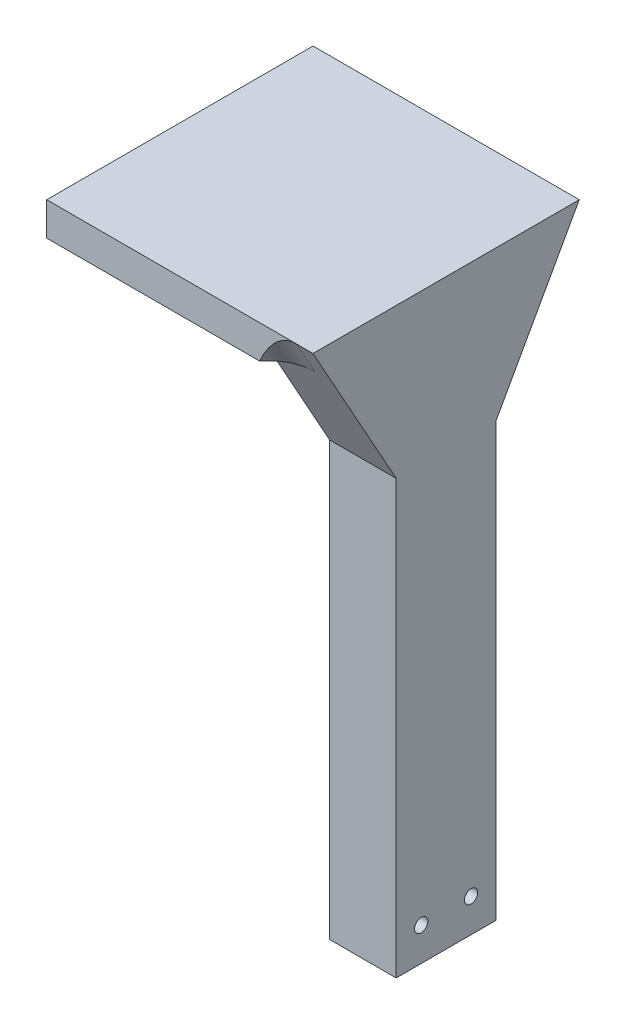
ISO-10303-21;
HEADER;
FILE_DESCRIPTION(('STEP AP214'),'2;1');
FILE_NAME('part.step','',(''),(''),'','','');
FILE_SCHEMA(('AUTOMOTIVE_DESIGN { 1 0 10303 214 1 1 1 1 }'));
ENDSEC;
DATA;
#1=APPLICATION_CONTEXT('core data for automotive mechanical design processes');
#2=APPLICATION_PROTOCOL_DEFINITION('international standard','automotive_design',2000,#1);
#3=PRODUCT_CONTEXT('',#1,'mechanical');
#4=PRODUCT('Part','Part','',(#3));
#5=PRODUCT_RELATED_PRODUCT_CATEGORY('part','',(#4));
#6=PRODUCT_DEFINITION_FORMATION('','',#4);
#7=PRODUCT_DEFINITION_CONTEXT('part definition',#1,'design');
#8=PRODUCT_DEFINITION('design','',#6,#7);
#9=PRODUCT_DEFINITION_SHAPE('','',#8);
#10=(LENGTH_UNIT() NAMED_UNIT(*) SI_UNIT(.MILLI.,.METRE.));
#11=(NAMED_UNIT(*) PLANE_ANGLE_UNIT() SI_UNIT($,.RADIAN.));
#12=(NAMED_UNIT(*) SI_UNIT($,.STERADIAN.) SOLID_ANGLE_UNIT());
#13=UNCERTAINTY_MEASURE_WITH_UNIT(LENGTH_MEASURE(1.E-05),#10,'distance_accuracy_value','');
#14=(GEOMETRIC_REPRESENTATION_CONTEXT(3) GLOBAL_UNCERTAINTY_ASSIGNED_CONTEXT((#13)) GLOBAL_UNIT_ASSIGNED_CONTEXT((#10,
#11,#12)) REPRESENTATION_CONTEXT('',''));
#15=CARTESIAN_POINT('',(0.,0.,0.));
#16=DIRECTION('',(0.,0.,1.));
#17=DIRECTION('',(1.,0.,0.));
#18=AXIS2_PLACEMENT_3D('',#15,#16,#17);
#19=CARTESIAN_POINT('',(0.,0.,80.));
#20=DIRECTION('',(1.,0.,0.));
#21=DIRECTION('',(0.,0.,-1.));
#22=AXIS2_PLACEMENT_3D('',#19,#20,#21);
#23=PLANE('',#22);
#24=CARTESIAN_POINT('',(0.,195.,32.5));
#25=DIRECTION('',(1.,0.,0.));
#26=DIRECTION('',(0.,0.,-1.));
#27=AXIS2_PLACEMENT_3D('',#24,#25,#26);
#28=CIRCLE('',#27,2.);
#29=CARTESIAN_POINT('',(0.,195.,30.5));
#30=VERTEX_POINT('',#29);
#31=EDGE_CURVE('E235',#30,#30,#28,.F.);
#32=ORIENTED_EDGE('',*,*,#31,.F.);
#33=EDGE_LOOP('',(#32));
#34=FACE_BOUND('',#33,.T.);
#35=CARTESIAN_POINT('',(0.,195.,47.5));
#36=DIRECTION('',(1.,0.,0.));
#37=DIRECTION('',(0.,0.,-1.));
#38=AXIS2_PLACEMENT_3D('',#35,#36,#37);
#39=CIRCLE('',#38,2.);
#40=CARTESIAN_POINT('',(0.,195.,45.5));
#41=VERTEX_POINT('',#40);
#42=EDGE_CURVE('E148',#41,#41,#39,.F.);
#43=ORIENTED_EDGE('',*,*,#42,.F.);
#44=EDGE_LOOP('',(#43));
#45=FACE_BOUND('',#44,.T.);
#46=DIRECTION('',(0.,1.,0.));
#47=VECTOR('',#46,1.);
#48=CARTESIAN_POINT('',(0.,0.,25.));
#49=LINE('',#48,#47);
#50=CARTESIAN_POINT('',(0.,185.,25.));
#51=VERTEX_POINT('',#50);
#52=CARTESIAN_POINT('',(0.,315.,25.));
#53=VERTEX_POINT('',#52);
#54=EDGE_CURVE('E158',#51,#53,#49,.T.);
#55=ORIENTED_EDGE('',*,*,#54,.F.);
#56=DIRECTION('',(0.,0.,1.));
#57=VECTOR('',#56,1.);
#58=CARTESIAN_POINT('',(0.,185.,80.));
#59=LINE('',#58,#57);
#60=CARTESIAN_POINT('',(0.,185.,55.));
#61=VERTEX_POINT('',#60);
#62=EDGE_CURVE('E47',#51,#61,#59,.T.);
#63=ORIENTED_EDGE('',*,*,#62,.T.);
#64=DIRECTION('',(0.,1.,0.));
#65=VECTOR('',#64,1.);
#66=CARTESIAN_POINT('',(0.,0.,55.));
#67=LINE('',#66,#65);
#68=CARTESIAN_POINT('',(0.,315.,55.));
#69=VERTEX_POINT('',#68);
#70=EDGE_CURVE('E152',#61,#69,#67,.T.);
#71=ORIENTED_EDGE('',*,*,#70,.T.);
#72=DIRECTION('',(0.,0.874157276121538,0.485642931178632));
#73=VECTOR('',#72,1.);
#74=CARTESIAN_POINT('',(0.,50.9433962264152,-91.6981132075472));
#75=LINE('',#74,#73);
#76=CARTESIAN_POINT('',(0.,350.,74.4444444444444));
#77=VERTEX_POINT('',#76);
#78=EDGE_CURVE('E155',#69,#77,#75,.T.);
#79=ORIENTED_EDGE('',*,*,#78,.T.);
#80=DIRECTION('',(0.,0.,-1.));
#81=VECTOR('',#80,1.);
#82=CARTESIAN_POINT('',(0.,350.,80.));
#83=LINE('',#82,#81);
#84=CARTESIAN_POINT('',(0.,350.,5.55555555555556));
#85=VERTEX_POINT('',#84);
#86=EDGE_CURVE('E187',#77,#85,#83,.T.);
#87=ORIENTED_EDGE('',*,*,#86,.T.);
#88=DIRECTION('',(0.,0.874157276121537,-0.485642931178633));
#89=VECTOR('',#88,1.);
#90=CARTESIAN_POINT('',(0.,84.9056603773587,152.830188679245));
#91=LINE('',#90,#89);
#92=EDGE_CURVE('E146',#53,#85,#91,.T.);
#93=ORIENTED_EDGE('',*,*,#92,.F.);
#94=EDGE_LOOP('',(#55,#63,#71,#79,#87,#93));
#95=FACE_BOUND('',#94,.T.);
#96=ADVANCED_FACE('F32',(#34,#45,#95),#23,.F.);
#97=CARTESIAN_POINT('',(20.,0.,80.));
#98=DIRECTION('',(-1.,0.,0.));
#99=DIRECTION('',(0.,0.,1.));
#100=AXIS2_PLACEMENT_3D('',#97,#98,#99);
#101=PLANE('',#100);
#102=CARTESIAN_POINT('',(20.,195.,32.5));
#103=DIRECTION('',(1.,0.,0.));
#104=DIRECTION('',(0.,0.,1.));
#105=AXIS2_PLACEMENT_3D('',#102,#103,#104);
#106=CIRCLE('',#105,2.);
#107=CARTESIAN_POINT('',(20.,195.,34.5));
#108=VERTEX_POINT('',#107);
#109=EDGE_CURVE('E232',#108,#108,#106,.T.);
#110=ORIENTED_EDGE('',*,*,#109,.F.);
#111=EDGE_LOOP('',(#110));
#112=FACE_BOUND('',#111,.T.);
#113=CARTESIAN_POINT('',(20.,195.,47.5));
#114=DIRECTION('',(1.,0.,0.));
#115=DIRECTION('',(0.,0.,-1.));
#116=AXIS2_PLACEMENT_3D('',#113,#114,#115);
#117=CIRCLE('',#116,2.);
#118=CARTESIAN_POINT('',(20.,195.,45.5));
#119=VERTEX_POINT('',#118);
#120=EDGE_CURVE('E241',#119,#119,#117,.T.);
#121=ORIENTED_EDGE('',*,*,#120,.F.);
#122=EDGE_LOOP('',(#121));
#123=FACE_BOUND('',#122,.T.);
#124=DIRECTION('',(0.,-1.,0.));
#125=VECTOR('',#124,1.);
#126=CARTESIAN_POINT('',(20.,0.,55.));
#127=LINE('',#126,#125);
#128=CARTESIAN_POINT('',(20.,315.,55.));
#129=VERTEX_POINT('',#128);
#130=CARTESIAN_POINT('',(20.,185.,55.));
#131=VERTEX_POINT('',#130);
#132=EDGE_CURVE('E138',#129,#131,#127,.T.);
#133=ORIENTED_EDGE('',*,*,#132,.T.);
#134=DIRECTION('',(0.,0.,-1.));
#135=VECTOR('',#134,1.);
#136=CARTESIAN_POINT('',(20.,185.,80.));
#137=LINE('',#136,#135);
#138=CARTESIAN_POINT('',(20.,185.,25.));
#139=VERTEX_POINT('',#138);
#140=EDGE_CURVE('E125',#131,#139,#137,.T.);
#141=ORIENTED_EDGE('',*,*,#140,.T.);
#142=DIRECTION('',(0.,-1.,0.));
#143=VECTOR('',#142,1.);
#144=CARTESIAN_POINT('',(20.,0.,25.));
#145=LINE('',#144,#143);
#146=CARTESIAN_POINT('',(20.,315.,25.));
#147=VERTEX_POINT('',#146);
#148=EDGE_CURVE('E135',#147,#139,#145,.T.);
#149=ORIENTED_EDGE('',*,*,#148,.F.);
#150=DIRECTION('',(0.,-0.874157276121537,0.485642931178633));
#151=VECTOR('',#150,1.);
#152=CARTESIAN_POINT('',(20.,84.9056603773587,152.830188679245));
#153=LINE('',#152,#151);
#154=CARTESIAN_POINT('',(20.,360.,0.));
#155=VERTEX_POINT('',#154);
#156=EDGE_CURVE('E144',#155,#147,#153,.T.);
#157=ORIENTED_EDGE('',*,*,#156,.F.);
#158=DIRECTION('',(0.,0.,-1.));
#159=VECTOR('',#158,1.);
#160=CARTESIAN_POINT('',(20.,360.,0.));
#161=LINE('',#160,#159);
#162=CARTESIAN_POINT('',(20.,360.,80.));
#163=VERTEX_POINT('',#162);
#164=EDGE_CURVE('E173',#163,#155,#161,.T.);
#165=ORIENTED_EDGE('',*,*,#164,.F.);
#166=DIRECTION('',(0.,-0.874157276121538,-0.485642931178632));
#167=VECTOR('',#166,1.);
#168=CARTESIAN_POINT('',(20.,50.9433962264152,-91.6981132075472));
#169=LINE('',#168,#167);
#170=EDGE_CURVE('E157',#163,#129,#169,.T.);
#171=ORIENTED_EDGE('',*,*,#170,.T.);
#172=EDGE_LOOP('',(#133,#141,#149,#157,#165,#171));
#173=FACE_BOUND('',#172,.T.);
#174=ADVANCED_FACE('F133',(#112,#123,#173),#101,.F.);
#175=CARTESIAN_POINT('',(0.,0.,0.));
#176=DIRECTION('',(0.,0.,-1.));
#177=DIRECTION('',(-1.,0.,0.));
#178=AXIS2_PLACEMENT_3D('',#175,#176,#177);
#179=PLANE('',#178);
#180=DIRECTION('',(-1.,0.,0.));
#181=VECTOR('',#180,1.);
#182=CARTESIAN_POINT('',(-60.,360.,0.));
#183=LINE('',#182,#181);
#184=CARTESIAN_POINT('',(15.,360.,0.));
#185=VERTEX_POINT('',#184);
#186=CARTESIAN_POINT('',(-60.,360.,0.));
#187=VERTEX_POINT('',#186);
#188=EDGE_CURVE('E74',#185,#187,#183,.T.);
#189=ORIENTED_EDGE('',*,*,#188,.F.);
#190=CARTESIAN_POINT('',(15.,329.113109577039,0.));
#191=DIRECTION('',(0.,0.,-1.));
#192=DIRECTION('',(0.,1.,0.));
#193=AXIS2_PLACEMENT_3D('',#190,#191,#192);
#194=ELLIPSE('',#193,30.8868904229609,15.);
#195=CARTESIAN_POINT('',(3.94975232434984,350.,0.));
#196=VERTEX_POINT('',#195);
#197=EDGE_CURVE('E203',#185,#196,#194,.F.);
#198=ORIENTED_EDGE('',*,*,#197,.T.);
#199=DIRECTION('',(-1.,0.,0.));
#200=VECTOR('',#199,1.);
#201=CARTESIAN_POINT('',(-60.,350.,0.));
#202=LINE('',#201,#200);
#203=CARTESIAN_POINT('',(-60.,350.,0.));
#204=VERTEX_POINT('',#203);
#205=EDGE_CURVE('E154',#196,#204,#202,.T.);
#206=ORIENTED_EDGE('',*,*,#205,.T.);
#207=DIRECTION('',(0.,-1.,0.));
#208=VECTOR('',#207,1.);
#209=CARTESIAN_POINT('',(-60.,360.,0.));
#210=LINE('',#209,#208);
#211=EDGE_CURVE('E184',#187,#204,#210,.T.);
#212=ORIENTED_EDGE('',*,*,#211,.F.);
#213=EDGE_LOOP('',(#189,#198,#206,#212));
#214=FACE_BOUND('',#213,.T.);
#215=ADVANCED_FACE('F212',(#214),#179,.T.);
#216=CARTESIAN_POINT('',(0.,0.,80.));
#217=DIRECTION('',(0.,0.,-1.));
#218=DIRECTION('',(-1.,0.,0.));
#219=AXIS2_PLACEMENT_3D('',#216,#217,#218);
#220=PLANE('',#219);
#221=DIRECTION('',(1.,0.,0.));
#222=VECTOR('',#221,1.);
#223=CARTESIAN_POINT('',(20.,350.,80.));
#224=LINE('',#223,#222);
#225=CARTESIAN_POINT('',(-60.,350.,80.));
#226=VERTEX_POINT('',#225);
#227=CARTESIAN_POINT('',(3.94975232434976,350.,80.));
#228=VERTEX_POINT('',#227);
#229=EDGE_CURVE('E180',#226,#228,#224,.T.);
#230=ORIENTED_EDGE('',*,*,#229,.T.);
#231=CARTESIAN_POINT('',(15.,329.113109577039,80.));
#232=DIRECTION('',(0.,0.,-1.));
#233=DIRECTION('',(0.,-1.,0.));
#234=AXIS2_PLACEMENT_3D('',#231,#232,#233);
#235=ELLIPSE('',#234,30.886890422961,15.);
#236=CARTESIAN_POINT('',(15.,360.,80.));
#237=VERTEX_POINT('',#236);
#238=EDGE_CURVE('E199',#228,#237,#235,.T.);
#239=ORIENTED_EDGE('',*,*,#238,.T.);
#240=DIRECTION('',(1.,0.,0.));
#241=VECTOR('',#240,1.);
#242=CARTESIAN_POINT('',(20.,360.,80.));
#243=LINE('',#242,#241);
#244=CARTESIAN_POINT('',(-60.,360.,80.));
#245=VERTEX_POINT('',#244);
#246=EDGE_CURVE('E171',#245,#237,#243,.T.);
#247=ORIENTED_EDGE('',*,*,#246,.F.);
#248=DIRECTION('',(0.,-1.,0.));
#249=VECTOR('',#248,1.);
#250=CARTESIAN_POINT('',(-60.,360.,80.));
#251=LINE('',#250,#249);
#252=EDGE_CURVE('E176',#245,#226,#251,.T.);
#253=ORIENTED_EDGE('',*,*,#252,.T.);
#254=EDGE_LOOP('',(#230,#239,#247,#253));
#255=FACE_BOUND('',#254,.T.);
#256=ADVANCED_FACE('F249',(#255),#220,.F.);
#257=CARTESIAN_POINT('',(0.,350.,0.));
#258=DIRECTION('',(0.,-1.,0.));
#259=DIRECTION('',(0.,0.,-1.));
#260=AXIS2_PLACEMENT_3D('',#257,#258,#259);
#261=PLANE('',#260);
#262=ORIENTED_EDGE('',*,*,#86,.F.);
#263=DIRECTION('',(-1.,0.,0.));
#264=VECTOR('',#263,1.);
#265=CARTESIAN_POINT('',(0.,350.,74.4444444444444));
#266=LINE('',#265,#264);
#267=CARTESIAN_POINT('',(15.,350.,74.4444444444444));
#268=VERTEX_POINT('',#267);
#269=EDGE_CURVE('E190',#268,#77,#266,.T.);
#270=ORIENTED_EDGE('',*,*,#269,.F.);
#271=CARTESIAN_POINT('',(15.,350.,91.603828012756));
#272=DIRECTION('',(0.,-1.,0.));
#273=DIRECTION('',(0.,0.,-1.));
#274=AXIS2_PLACEMENT_3D('',#271,#272,#273);
#275=ELLIPSE('',#274,17.1593835683117,15.);
#276=EDGE_CURVE('E83',#268,#228,#275,.F.);
#277=ORIENTED_EDGE('',*,*,#276,.T.);
#278=ORIENTED_EDGE('',*,*,#229,.F.);
#279=DIRECTION('',(0.,0.,1.));
#280=VECTOR('',#279,1.);
#281=CARTESIAN_POINT('',(-60.,350.,80.));
#282=LINE('',#281,#280);
#283=EDGE_CURVE('E178',#204,#226,#282,.T.);
#284=ORIENTED_EDGE('',*,*,#283,.F.);
#285=ORIENTED_EDGE('',*,*,#205,.F.);
#286=CARTESIAN_POINT('',(15.,350.,-11.6038280127561));
#287=DIRECTION('',(0.,-1.,0.));
#288=DIRECTION('',(0.,0.,-1.));
#289=AXIS2_PLACEMENT_3D('',#286,#287,#288);
#290=ELLIPSE('',#289,17.1593835683117,15.);
#291=CARTESIAN_POINT('',(15.,350.,5.5555555555556));
#292=VERTEX_POINT('',#291);
#293=EDGE_CURVE('E40',#196,#292,#290,.F.);
#294=ORIENTED_EDGE('',*,*,#293,.T.);
#295=DIRECTION('',(1.,0.,0.));
#296=VECTOR('',#295,1.);
#297=CARTESIAN_POINT('',(-268.759188302499,350.,5.55555555555559));
#298=LINE('',#297,#296);
#299=EDGE_CURVE('E55',#85,#292,#298,.T.);
#300=ORIENTED_EDGE('',*,*,#299,.F.);
#301=EDGE_LOOP('',(#262,#270,#277,#278,#284,#285,#294,#300));
#302=FACE_BOUND('',#301,.T.);
#303=ADVANCED_FACE('F205',(#302),#261,.T.);
#304=CARTESIAN_POINT('',(-60.,360.,80.));
#305=DIRECTION('',(1.,0.,0.));
#306=DIRECTION('',(0.,0.,-1.));
#307=AXIS2_PLACEMENT_3D('',#304,#305,#306);
#308=PLANE('',#307);
#309=ORIENTED_EDGE('',*,*,#283,.T.);
#310=ORIENTED_EDGE('',*,*,#252,.F.);
#311=DIRECTION('',(0.,0.,1.));
#312=VECTOR('',#311,1.);
#313=CARTESIAN_POINT('',(-60.,360.,80.));
#314=LINE('',#313,#312);
#315=EDGE_CURVE('E169',#187,#245,#314,.T.);
#316=ORIENTED_EDGE('',*,*,#315,.F.);
#317=ORIENTED_EDGE('',*,*,#211,.T.);
#318=EDGE_LOOP('',(#309,#310,#316,#317));
#319=FACE_BOUND('',#318,.T.);
#320=ADVANCED_FACE('F217',(#319),#308,.F.);
#321=CARTESIAN_POINT('',(0.,360.,0.));
#322=DIRECTION('',(0.,-1.,0.));
#323=DIRECTION('',(0.,0.,-1.));
#324=AXIS2_PLACEMENT_3D('',#321,#322,#323);
#325=PLANE('',#324);
#326=EDGE_CURVE('E166',#155,#185,#183,.T.);
#327=ORIENTED_EDGE('',*,*,#326,.T.);
#328=ORIENTED_EDGE('',*,*,#188,.T.);
#329=ORIENTED_EDGE('',*,*,#315,.T.);
#330=ORIENTED_EDGE('',*,*,#246,.T.);
#331=DIRECTION('',(1.,0.,0.));
#332=VECTOR('',#331,1.);
#333=CARTESIAN_POINT('',(-268.759188302499,360.,80.));
#334=LINE('',#333,#332);
#335=EDGE_CURVE('E161',#237,#163,#334,.T.);
#336=ORIENTED_EDGE('',*,*,#335,.T.);
#337=ORIENTED_EDGE('',*,*,#164,.T.);
#338=EDGE_LOOP('',(#327,#328,#329,#330,#336,#337));
#339=FACE_BOUND('',#338,.T.);
#340=ADVANCED_FACE('F220',(#339),#325,.F.);
#341=CARTESIAN_POINT('',(-268.759188302499,50.9433962264152,-91.6981132075472));
#342=DIRECTION('',(0.,-0.485642931178632,0.874157276121538));
#343=DIRECTION('',(0.,-0.874157276121538,-0.485642931178632));
#344=AXIS2_PLACEMENT_3D('',#341,#342,#343);
#345=PLANE('',#344);
#346=ORIENTED_EDGE('',*,*,#335,.F.);
#347=DIRECTION('',(0.,0.874157276121538,0.485642931178632));
#348=VECTOR('',#347,1.);
#349=CARTESIAN_POINT('',(15.,350.,74.4444444444444));
#350=LINE('',#349,#348);
#351=EDGE_CURVE('E192',#237,#268,#350,.F.);
#352=ORIENTED_EDGE('',*,*,#351,.T.);
#353=ORIENTED_EDGE('',*,*,#269,.T.);
#354=ORIENTED_EDGE('',*,*,#78,.F.);
#355=DIRECTION('',(1.,0.,0.));
#356=VECTOR('',#355,1.);
#357=CARTESIAN_POINT('',(-268.759188302499,315.,55.));
#358=LINE('',#357,#356);
#359=EDGE_CURVE('E160',#69,#129,#358,.T.);
#360=ORIENTED_EDGE('',*,*,#359,.T.);
#361=ORIENTED_EDGE('',*,*,#170,.F.);
#362=EDGE_LOOP('',(#346,#352,#353,#354,#360,#361));
#363=FACE_BOUND('',#362,.T.);
#364=ADVANCED_FACE('F225',(#363),#345,.T.);
#365=CARTESIAN_POINT('',(-268.759188302499,0.,55.));
#366=DIRECTION('',(0.,0.,1.));
#367=DIRECTION('',(0.,-1.,0.));
#368=AXIS2_PLACEMENT_3D('',#365,#366,#367);
#369=PLANE('',#368);
#370=DIRECTION('',(-1.,0.,0.));
#371=VECTOR('',#370,1.);
#372=CARTESIAN_POINT('',(-268.759188302499,185.,55.));
#373=LINE('',#372,#371);
#374=EDGE_CURVE('E231',#131,#61,#373,.T.);
#375=ORIENTED_EDGE('',*,*,#374,.F.);
#376=ORIENTED_EDGE('',*,*,#132,.F.);
#377=ORIENTED_EDGE('',*,*,#359,.F.);
#378=ORIENTED_EDGE('',*,*,#70,.F.);
#379=EDGE_LOOP('',(#375,#376,#377,#378));
#380=FACE_BOUND('',#379,.T.);
#381=ADVANCED_FACE('F230',(#380),#369,.T.);
#382=CARTESIAN_POINT('',(-268.759188302499,0.,25.));
#383=DIRECTION('',(0.,0.,1.));
#384=DIRECTION('',(0.,-1.,0.));
#385=AXIS2_PLACEMENT_3D('',#382,#383,#384);
#386=PLANE('',#385);
#387=ORIENTED_EDGE('',*,*,#148,.T.);
#388=DIRECTION('',(-1.,0.,0.));
#389=VECTOR('',#388,1.);
#390=CARTESIAN_POINT('',(-268.759188302499,185.,25.));
#391=LINE('',#390,#389);
#392=EDGE_CURVE('E11',#139,#51,#391,.T.);
#393=ORIENTED_EDGE('',*,*,#392,.T.);
#394=ORIENTED_EDGE('',*,*,#54,.T.);
#395=DIRECTION('',(1.,0.,0.));
#396=VECTOR('',#395,1.);
#397=CARTESIAN_POINT('',(-268.759188302499,315.,25.));
#398=LINE('',#397,#396);
#399=EDGE_CURVE('E142',#53,#147,#398,.T.);
#400=ORIENTED_EDGE('',*,*,#399,.T.);
#401=EDGE_LOOP('',(#387,#393,#394,#400));
#402=FACE_BOUND('',#401,.T.);
#403=ADVANCED_FACE('F140',(#402),#386,.F.);
#404=CARTESIAN_POINT('',(-268.759188302499,84.9056603773587,152.830188679245));
#405=DIRECTION('',(0.,0.485642931178633,0.874157276121537));
#406=DIRECTION('',(0.,-0.874157276121537,0.485642931178633));
#407=AXIS2_PLACEMENT_3D('',#404,#405,#406);
#408=PLANE('',#407);
#409=ORIENTED_EDGE('',*,*,#299,.T.);
#410=DIRECTION('',(0.,0.874157276121537,-0.485642931178633));
#411=VECTOR('',#410,1.);
#412=CARTESIAN_POINT('',(15.,84.9056603773587,152.830188679245));
#413=LINE('',#412,#411);
#414=EDGE_CURVE('E196',#292,#185,#413,.T.);
#415=ORIENTED_EDGE('',*,*,#414,.T.);
#416=ORIENTED_EDGE('',*,*,#326,.F.);
#417=ORIENTED_EDGE('',*,*,#156,.T.);
#418=ORIENTED_EDGE('',*,*,#399,.F.);
#419=ORIENTED_EDGE('',*,*,#92,.T.);
#420=EDGE_LOOP('',(#409,#415,#416,#417,#418,#419));
#421=FACE_BOUND('',#420,.T.);
#422=ADVANCED_FACE('F210',(#421),#408,.F.);
#423=CARTESIAN_POINT('',(15.,77.6210164096791,-59.7178295374223));
#424=DIRECTION('',(0.,-0.874157276121538,-0.485642931178632));
#425=DIRECTION('',(0.,0.485642931178632,-0.874157276121538));
#426=AXIS2_PLACEMENT_3D('',#423,#424,#425);
#427=CYLINDRICAL_SURFACE('',#426,15.);
#428=ORIENTED_EDGE('',*,*,#276,.F.);
#429=ORIENTED_EDGE('',*,*,#351,.F.);
#430=ORIENTED_EDGE('',*,*,#238,.F.);
#431=EDGE_LOOP('',(#428,#429,#430));
#432=FACE_BOUND('',#431,.T.);
#433=ADVANCED_FACE('F247',(#432),#427,.F.);
#434=CARTESIAN_POINT('',(15.,77.6210164096793,139.717829537422));
#435=DIRECTION('',(0.,0.874157276121537,-0.485642931178633));
#436=DIRECTION('',(0.,0.485642931178633,0.874157276121537));
#437=AXIS2_PLACEMENT_3D('',#434,#435,#436);
#438=CYLINDRICAL_SURFACE('',#437,15.);
#439=ORIENTED_EDGE('',*,*,#293,.F.);
#440=ORIENTED_EDGE('',*,*,#197,.F.);
#441=ORIENTED_EDGE('',*,*,#414,.F.);
#442=EDGE_LOOP('',(#439,#440,#441));
#443=FACE_BOUND('',#442,.T.);
#444=ADVANCED_FACE('F34',(#443),#438,.F.);
#445=CARTESIAN_POINT('',(-5.65685424949239,195.,47.5));
#446=DIRECTION('',(1.,0.,0.));
#447=DIRECTION('',(0.,0.,-1.));
#448=AXIS2_PLACEMENT_3D('',#445,#446,#447);
#449=CYLINDRICAL_SURFACE('',#448,2.);
#450=ORIENTED_EDGE('',*,*,#42,.T.);
#451=EDGE_LOOP('',(#450));
#452=FACE_BOUND('',#451,.T.);
#453=ORIENTED_EDGE('',*,*,#120,.T.);
#454=EDGE_LOOP('',(#453));
#455=FACE_BOUND('',#454,.T.);
#456=ADVANCED_FACE('F275',(#452,#455),#449,.F.);
#457=CARTESIAN_POINT('',(-5.65685424949239,195.,32.5));
#458=DIRECTION('',(1.,0.,0.));
#459=DIRECTION('',(0.,0.,-1.));
#460=AXIS2_PLACEMENT_3D('',#457,#458,#459);
#461=CYLINDRICAL_SURFACE('',#460,2.);
#462=ORIENTED_EDGE('',*,*,#31,.T.);
#463=EDGE_LOOP('',(#462));
#464=FACE_BOUND('',#463,.T.);
#465=ORIENTED_EDGE('',*,*,#109,.T.);
#466=EDGE_LOOP('',(#465));
#467=FACE_BOUND('',#466,.T.);
#468=ADVANCED_FACE('F345',(#464,#467),#461,.F.);
#469=CARTESIAN_POINT('',(-60.,185.,208.559376050786));
#470=DIRECTION('',(0.,1.,0.));
#471=DIRECTION('',(0.,0.,1.));
#472=AXIS2_PLACEMENT_3D('',#469,#470,#471);
#473=PLANE('',#472);
#474=ORIENTED_EDGE('',*,*,#374,.T.);
#475=ORIENTED_EDGE('',*,*,#62,.F.);
#476=ORIENTED_EDGE('',*,*,#392,.F.);
#477=ORIENTED_EDGE('',*,*,#140,.F.);
#478=EDGE_LOOP('',(#474,#475,#476,#477));
#479=FACE_BOUND('',#478,.T.);
#480=ADVANCED_FACE('F124',(#479),#473,.F.);
#481=CLOSED_SHELL('',(#96,#174,#215,#256,#303,#320,#340,#364,#381,#403,#422,#433,#444,#456,#468,#480));
#482=MANIFOLD_SOLID_BREP('B2',#481);
#483=ADVANCED_BREP_SHAPE_REPRESENTATION('',(#18,#482),#14);
#484=SHAPE_DEFINITION_REPRESENTATION(#9,#483);
ENDSEC;
END-ISO-10303-21;
